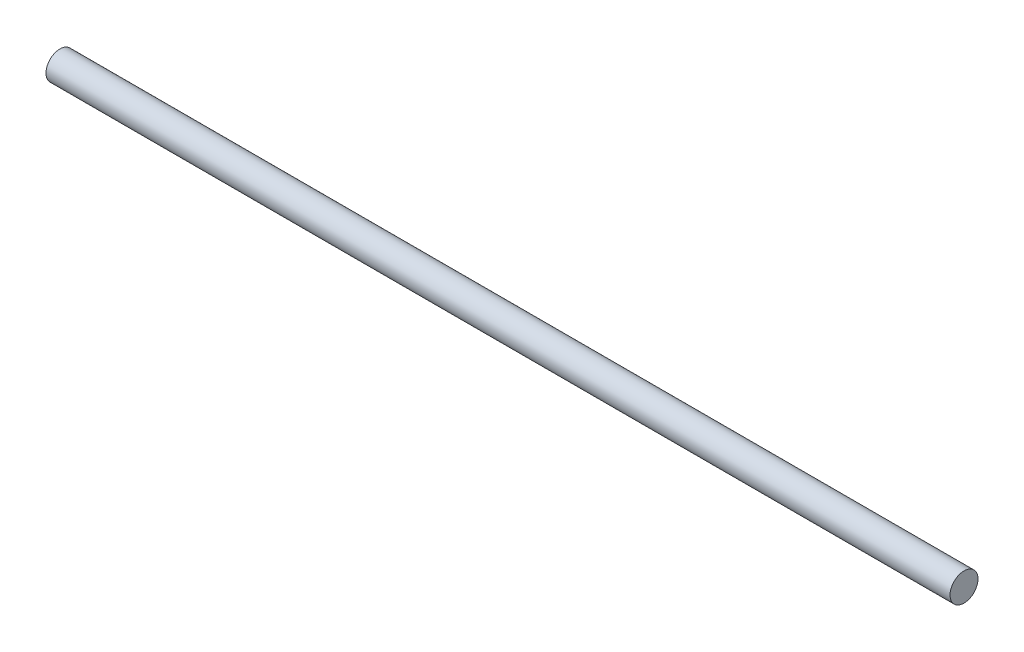
ISO-10303-21;
HEADER;
FILE_DESCRIPTION(('STEP AP214'),'2;1');
FILE_NAME('part.step','',(''),(''),'','','');
FILE_SCHEMA(('AUTOMOTIVE_DESIGN { 1 0 10303 214 1 1 1 1 }'));
ENDSEC;
DATA;
#1=APPLICATION_CONTEXT('core data for automotive mechanical design processes');
#2=APPLICATION_PROTOCOL_DEFINITION('international standard','automotive_design',2000,#1);
#3=PRODUCT_CONTEXT('',#1,'mechanical');
#4=PRODUCT('Part','Part','',(#3));
#5=PRODUCT_RELATED_PRODUCT_CATEGORY('part','',(#4));
#6=PRODUCT_DEFINITION_FORMATION('','',#4);
#7=PRODUCT_DEFINITION_CONTEXT('part definition',#1,'design');
#8=PRODUCT_DEFINITION('design','',#6,#7);
#9=PRODUCT_DEFINITION_SHAPE('','',#8);
#10=(LENGTH_UNIT() NAMED_UNIT(*) SI_UNIT(.MILLI.,.METRE.));
#11=(NAMED_UNIT(*) PLANE_ANGLE_UNIT() SI_UNIT($,.RADIAN.));
#12=(NAMED_UNIT(*) SI_UNIT($,.STERADIAN.) SOLID_ANGLE_UNIT());
#13=UNCERTAINTY_MEASURE_WITH_UNIT(LENGTH_MEASURE(1.E-05),#10,'distance_accuracy_value','');
#14=(GEOMETRIC_REPRESENTATION_CONTEXT(3) GLOBAL_UNCERTAINTY_ASSIGNED_CONTEXT((#13)) GLOBAL_UNIT_ASSIGNED_CONTEXT((#10,
#11,#12)) REPRESENTATION_CONTEXT('',''));
#15=CARTESIAN_POINT('',(0.,0.,0.));
#16=DIRECTION('',(0.,0.,1.));
#17=DIRECTION('',(1.,0.,0.));
#18=AXIS2_PLACEMENT_3D('',#15,#16,#17);
#19=CARTESIAN_POINT('',(97.,0.,0.));
#20=DIRECTION('',(-1.,0.,0.));
#21=DIRECTION('',(0.,0.,1.));
#22=AXIS2_PLACEMENT_3D('',#19,#20,#21);
#23=CYLINDRICAL_SURFACE('',#22,1.5);
#24=CARTESIAN_POINT('',(97.,0.,0.));
#25=DIRECTION('',(1.,0.,0.));
#26=DIRECTION('',(0.,0.,-1.));
#27=AXIS2_PLACEMENT_3D('',#24,#25,#26);
#28=CIRCLE('',#27,1.5);
#29=CARTESIAN_POINT('',(97.,0.,-1.5));
#30=VERTEX_POINT('',#29);
#31=EDGE_CURVE('E10',#30,#30,#28,.T.);
#32=ORIENTED_EDGE('',*,*,#31,.F.);
#33=EDGE_LOOP('',(#32));
#34=FACE_BOUND('',#33,.T.);
#35=CARTESIAN_POINT('',(0.,0.,0.));
#36=DIRECTION('',(1.,0.,0.));
#37=DIRECTION('',(0.,0.,-1.));
#38=AXIS2_PLACEMENT_3D('',#35,#36,#37);
#39=CIRCLE('',#38,1.5);
#40=CARTESIAN_POINT('',(0.,0.,-1.5));
#41=VERTEX_POINT('',#40);
#42=EDGE_CURVE('E36',#41,#41,#39,.T.);
#43=ORIENTED_EDGE('',*,*,#42,.T.);
#44=EDGE_LOOP('',(#43));
#45=FACE_BOUND('',#44,.T.);
#46=ADVANCED_FACE('F33',(#34,#45),#23,.T.);
#47=CARTESIAN_POINT('',(97.,0.,0.));
#48=DIRECTION('',(1.,0.,0.));
#49=DIRECTION('',(0.,0.,-1.));
#50=AXIS2_PLACEMENT_3D('',#47,#48,#49);
#51=PLANE('',#50);
#52=ORIENTED_EDGE('',*,*,#31,.T.);
#53=EDGE_LOOP('',(#52));
#54=FACE_BOUND('',#53,.T.);
#55=ADVANCED_FACE('F48',(#54),#51,.T.);
#56=CARTESIAN_POINT('',(0.,0.,0.));
#57=DIRECTION('',(1.,0.,0.));
#58=DIRECTION('',(0.,0.,-1.));
#59=AXIS2_PLACEMENT_3D('',#56,#57,#58);
#60=PLANE('',#59);
#61=ORIENTED_EDGE('',*,*,#42,.F.);
#62=EDGE_LOOP('',(#61));
#63=FACE_BOUND('',#62,.T.);
#64=ADVANCED_FACE('F46',(#63),#60,.F.);
#65=CLOSED_SHELL('',(#46,#55,#64));
#66=MANIFOLD_SOLID_BREP('B2',#65);
#67=ADVANCED_BREP_SHAPE_REPRESENTATION('',(#18,#66),#14);
#68=SHAPE_DEFINITION_REPRESENTATION(#9,#67);
ENDSEC;
END-ISO-10303-21;
